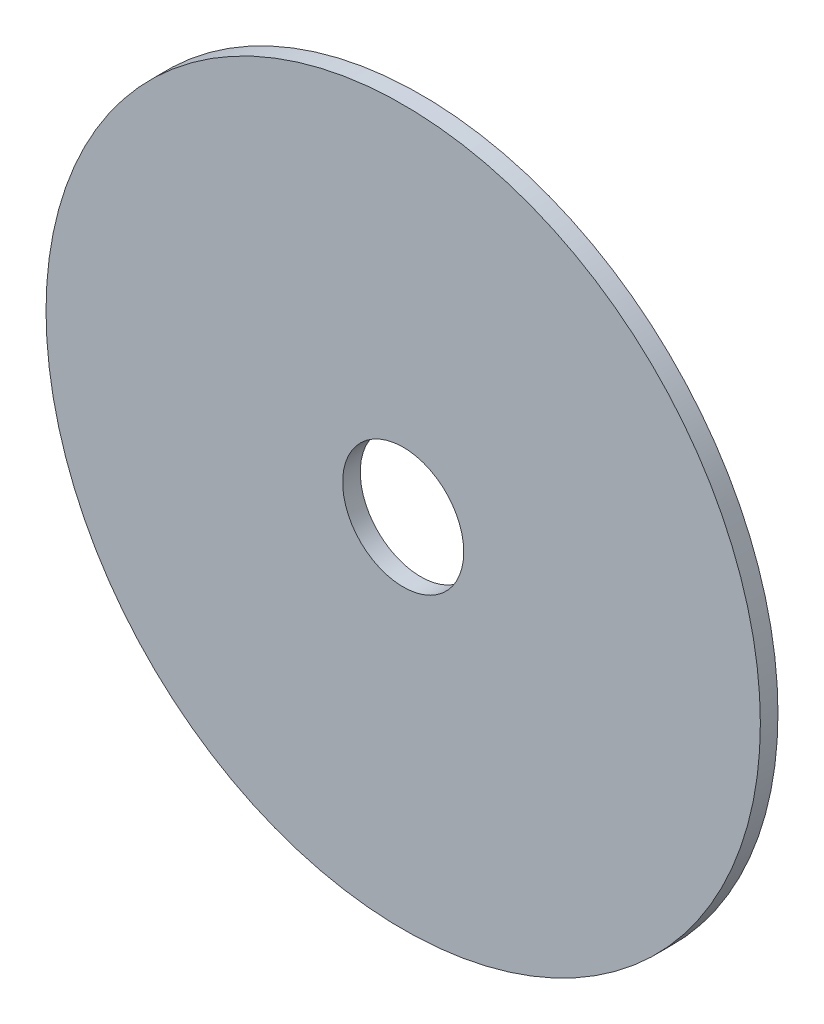
ISO-10303-21;
HEADER;
FILE_DESCRIPTION(('STEP AP214'),'2;1');
FILE_NAME('part.step','',(''),(''),'','','');
FILE_SCHEMA(('AUTOMOTIVE_DESIGN { 1 0 10303 214 1 1 1 1 }'));
ENDSEC;
DATA;
#1=APPLICATION_CONTEXT('core data for automotive mechanical design processes');
#2=APPLICATION_PROTOCOL_DEFINITION('international standard','automotive_design',2000,#1);
#3=PRODUCT_CONTEXT('',#1,'mechanical');
#4=PRODUCT('Part','Part','',(#3));
#5=PRODUCT_RELATED_PRODUCT_CATEGORY('part','',(#4));
#6=PRODUCT_DEFINITION_FORMATION('','',#4);
#7=PRODUCT_DEFINITION_CONTEXT('part definition',#1,'design');
#8=PRODUCT_DEFINITION('design','',#6,#7);
#9=PRODUCT_DEFINITION_SHAPE('','',#8);
#10=(LENGTH_UNIT() NAMED_UNIT(*) SI_UNIT(.MILLI.,.METRE.));
#11=(NAMED_UNIT(*) PLANE_ANGLE_UNIT() SI_UNIT($,.RADIAN.));
#12=(NAMED_UNIT(*) SI_UNIT($,.STERADIAN.) SOLID_ANGLE_UNIT());
#13=UNCERTAINTY_MEASURE_WITH_UNIT(LENGTH_MEASURE(1.E-05),#10,'distance_accuracy_value','');
#14=(GEOMETRIC_REPRESENTATION_CONTEXT(3) GLOBAL_UNCERTAINTY_ASSIGNED_CONTEXT((#13)) GLOBAL_UNIT_ASSIGNED_CONTEXT((#10,
#11,#12)) REPRESENTATION_CONTEXT('',''));
#15=CARTESIAN_POINT('',(0.,0.,0.));
#16=DIRECTION('',(0.,0.,1.));
#17=DIRECTION('',(1.,0.,0.));
#18=AXIS2_PLACEMENT_3D('',#15,#16,#17);
#19=CARTESIAN_POINT('',(0.,0.,3.175));
#20=DIRECTION('',(0.,0.,-1.));
#21=DIRECTION('',(-1.,0.,0.));
#22=AXIS2_PLACEMENT_3D('',#19,#20,#21);
#23=CYLINDRICAL_SURFACE('',#22,10.9163147014637);
#24=CARTESIAN_POINT('',(0.,0.,3.175));
#25=DIRECTION('',(0.,0.,1.));
#26=DIRECTION('',(1.,0.,0.));
#27=AXIS2_PLACEMENT_3D('',#24,#25,#26);
#28=CIRCLE('',#27,10.9163147014637);
#29=CARTESIAN_POINT('',(10.9163147014637,0.,3.175));
#30=VERTEX_POINT('',#29);
#31=EDGE_CURVE('E42',#30,#30,#28,.T.);
#32=ORIENTED_EDGE('',*,*,#31,.T.);
#33=EDGE_LOOP('',(#32));
#34=FACE_BOUND('',#33,.T.);
#35=CARTESIAN_POINT('',(0.,0.,0.));
#36=DIRECTION('',(0.,0.,1.));
#37=DIRECTION('',(1.,0.,0.));
#38=AXIS2_PLACEMENT_3D('',#35,#36,#37);
#39=CIRCLE('',#38,10.9163147014637);
#40=CARTESIAN_POINT('',(10.9163147014637,0.,0.));
#41=VERTEX_POINT('',#40);
#42=EDGE_CURVE('E48',#41,#41,#39,.T.);
#43=ORIENTED_EDGE('',*,*,#42,.F.);
#44=EDGE_LOOP('',(#43));
#45=FACE_BOUND('',#44,.T.);
#46=ADVANCED_FACE('F35',(#34,#45),#23,.F.);
#47=CARTESIAN_POINT('',(0.,0.,3.175));
#48=DIRECTION('',(0.,0.,-1.));
#49=DIRECTION('',(-1.,0.,0.));
#50=AXIS2_PLACEMENT_3D('',#47,#48,#49);
#51=CYLINDRICAL_SURFACE('',#50,64.39);
#52=CARTESIAN_POINT('',(0.,0.,3.175));
#53=DIRECTION('',(0.,0.,1.));
#54=DIRECTION('',(1.,0.,0.));
#55=AXIS2_PLACEMENT_3D('',#52,#53,#54);
#56=CIRCLE('',#55,64.39);
#57=CARTESIAN_POINT('',(64.39,0.,3.175));
#58=VERTEX_POINT('',#57);
#59=EDGE_CURVE('E10',#58,#58,#56,.T.);
#60=ORIENTED_EDGE('',*,*,#59,.F.);
#61=EDGE_LOOP('',(#60));
#62=FACE_BOUND('',#61,.T.);
#63=CARTESIAN_POINT('',(0.,0.,0.));
#64=DIRECTION('',(0.,0.,1.));
#65=DIRECTION('',(1.,0.,0.));
#66=AXIS2_PLACEMENT_3D('',#63,#64,#65);
#67=CIRCLE('',#66,64.39);
#68=CARTESIAN_POINT('',(64.39,0.,0.));
#69=VERTEX_POINT('',#68);
#70=EDGE_CURVE('E38',#69,#69,#67,.T.);
#71=ORIENTED_EDGE('',*,*,#70,.T.);
#72=EDGE_LOOP('',(#71));
#73=FACE_BOUND('',#72,.T.);
#74=ADVANCED_FACE('F55',(#62,#73),#51,.T.);
#75=CARTESIAN_POINT('',(0.,0.,3.175));
#76=DIRECTION('',(0.,0.,1.));
#77=DIRECTION('',(1.,0.,0.));
#78=AXIS2_PLACEMENT_3D('',#75,#76,#77);
#79=PLANE('',#78);
#80=ORIENTED_EDGE('',*,*,#31,.F.);
#81=EDGE_LOOP('',(#80));
#82=FACE_BOUND('',#81,.T.);
#83=ORIENTED_EDGE('',*,*,#59,.T.);
#84=EDGE_LOOP('',(#83));
#85=FACE_BOUND('',#84,.T.);
#86=ADVANCED_FACE('F59',(#82,#85),#79,.T.);
#87=CARTESIAN_POINT('',(0.,0.,0.));
#88=DIRECTION('',(0.,0.,1.));
#89=DIRECTION('',(1.,0.,0.));
#90=AXIS2_PLACEMENT_3D('',#87,#88,#89);
#91=PLANE('',#90);
#92=ORIENTED_EDGE('',*,*,#42,.T.);
#93=EDGE_LOOP('',(#92));
#94=FACE_BOUND('',#93,.T.);
#95=ORIENTED_EDGE('',*,*,#70,.F.);
#96=EDGE_LOOP('',(#95));
#97=FACE_BOUND('',#96,.T.);
#98=ADVANCED_FACE('F57',(#94,#97),#91,.F.);
#99=CLOSED_SHELL('',(#46,#74,#86,#98));
#100=MANIFOLD_SOLID_BREP('B2',#99);
#101=ADVANCED_BREP_SHAPE_REPRESENTATION('',(#18,#100),#14);
#102=SHAPE_DEFINITION_REPRESENTATION(#9,#101);
ENDSEC;
END-ISO-10303-21;
